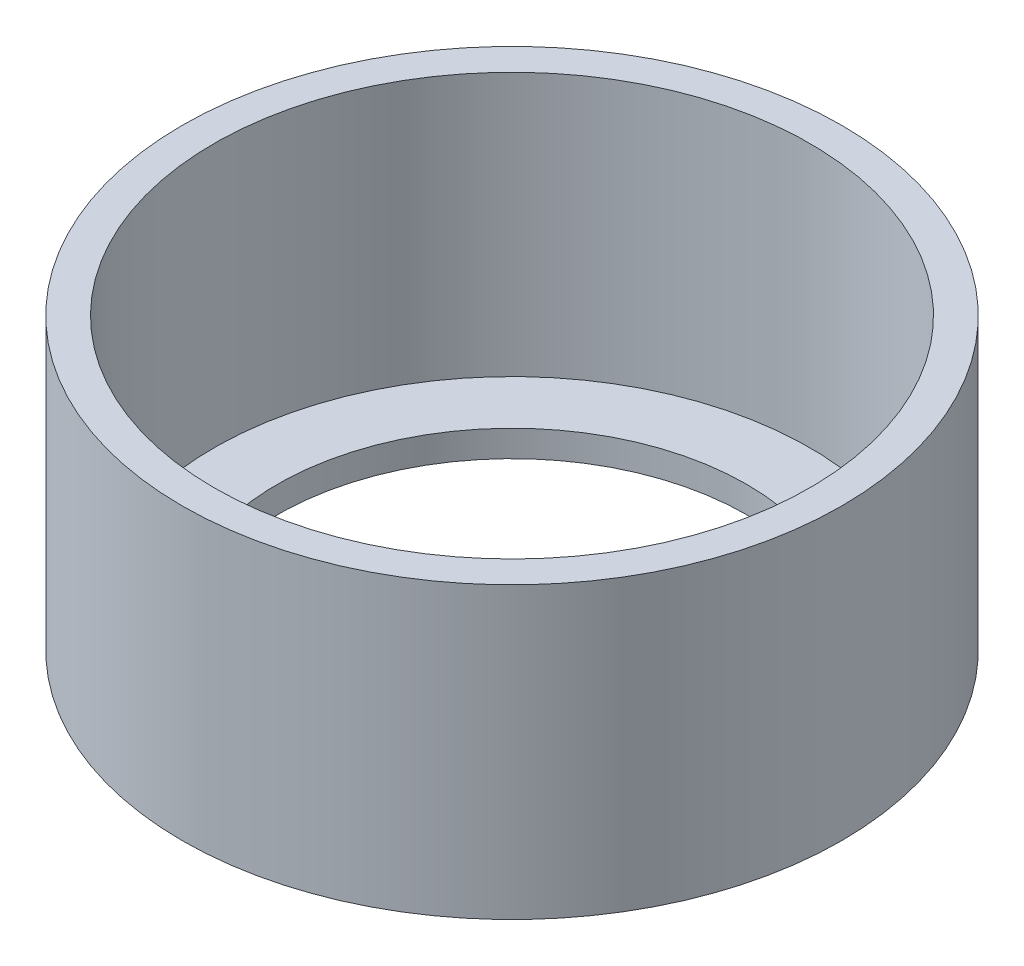
ISO-10303-21;
HEADER;
FILE_DESCRIPTION(('STEP AP214'),'2;1');
FILE_NAME('part.step','',(''),(''),'','','');
FILE_SCHEMA(('AUTOMOTIVE_DESIGN { 1 0 10303 214 1 1 1 1 }'));
ENDSEC;
DATA;
#1=APPLICATION_CONTEXT('core data for automotive mechanical design processes');
#2=APPLICATION_PROTOCOL_DEFINITION('international standard','automotive_design',2000,#1);
#3=PRODUCT_CONTEXT('',#1,'mechanical');
#4=PRODUCT('Part','Part','',(#3));
#5=PRODUCT_RELATED_PRODUCT_CATEGORY('part','',(#4));
#6=PRODUCT_DEFINITION_FORMATION('','',#4);
#7=PRODUCT_DEFINITION_CONTEXT('part definition',#1,'design');
#8=PRODUCT_DEFINITION('design','',#6,#7);
#9=PRODUCT_DEFINITION_SHAPE('','',#8);
#10=(LENGTH_UNIT() NAMED_UNIT(*) SI_UNIT(.MILLI.,.METRE.));
#11=(NAMED_UNIT(*) PLANE_ANGLE_UNIT() SI_UNIT($,.RADIAN.));
#12=(NAMED_UNIT(*) SI_UNIT($,.STERADIAN.) SOLID_ANGLE_UNIT());
#13=UNCERTAINTY_MEASURE_WITH_UNIT(LENGTH_MEASURE(1.E-05),#10,'distance_accuracy_value','');
#14=(GEOMETRIC_REPRESENTATION_CONTEXT(3) GLOBAL_UNCERTAINTY_ASSIGNED_CONTEXT((#13)) GLOBAL_UNIT_ASSIGNED_CONTEXT((#10,
#11,#12)) REPRESENTATION_CONTEXT('',''));
#15=CARTESIAN_POINT('',(0.,0.,0.));
#16=DIRECTION('',(0.,0.,1.));
#17=DIRECTION('',(1.,0.,0.));
#18=AXIS2_PLACEMENT_3D('',#15,#16,#17);
#19=CARTESIAN_POINT('',(0.,5.,0.));
#20=DIRECTION('',(0.,1.,0.));
#21=DIRECTION('',(0.,0.,1.));
#22=AXIS2_PLACEMENT_3D('',#19,#20,#21);
#23=PLANE('',#22);
#24=CARTESIAN_POINT('',(0.,5.,0.));
#25=DIRECTION('',(0.,1.,0.));
#26=DIRECTION('',(0.,0.,1.));
#27=AXIS2_PLACEMENT_3D('',#24,#25,#26);
#28=CIRCLE('',#27,6.255);
#29=CARTESIAN_POINT('',(0.,5.,6.255));
#30=VERTEX_POINT('',#29);
#31=EDGE_CURVE('E10',#30,#30,#28,.T.);
#32=ORIENTED_EDGE('',*,*,#31,.T.);
#33=EDGE_LOOP('',(#32));
#34=FACE_BOUND('',#33,.T.);
#35=CARTESIAN_POINT('',(0.,5.,0.));
#36=DIRECTION('',(0.,1.,0.));
#37=DIRECTION('',(0.,0.,1.));
#38=AXIS2_PLACEMENT_3D('',#35,#36,#37);
#39=CIRCLE('',#38,5.655);
#40=CARTESIAN_POINT('',(0.,5.,5.655));
#41=VERTEX_POINT('',#40);
#42=EDGE_CURVE('E45',#41,#41,#39,.T.);
#43=ORIENTED_EDGE('',*,*,#42,.F.);
#44=EDGE_LOOP('',(#43));
#45=FACE_BOUND('',#44,.T.);
#46=ADVANCED_FACE('F37',(#34,#45),#23,.T.);
#47=CARTESIAN_POINT('',(0.,5.,0.));
#48=DIRECTION('',(0.,-1.,0.));
#49=DIRECTION('',(0.,0.,-1.));
#50=AXIS2_PLACEMENT_3D('',#47,#48,#49);
#51=CYLINDRICAL_SURFACE('',#50,6.255);
#52=ORIENTED_EDGE('',*,*,#31,.F.);
#53=EDGE_LOOP('',(#52));
#54=FACE_BOUND('',#53,.T.);
#55=CARTESIAN_POINT('',(0.,-0.5,0.));
#56=DIRECTION('',(0.,-1.,0.));
#57=DIRECTION('',(0.,0.,-1.));
#58=AXIS2_PLACEMENT_3D('',#55,#56,#57);
#59=CIRCLE('',#58,6.255);
#60=CARTESIAN_POINT('',(0.,-0.5,-6.255));
#61=VERTEX_POINT('',#60);
#62=EDGE_CURVE('E56',#61,#61,#59,.T.);
#63=ORIENTED_EDGE('',*,*,#62,.F.);
#64=EDGE_LOOP('',(#63));
#65=FACE_BOUND('',#64,.T.);
#66=ADVANCED_FACE('F39',(#54,#65),#51,.T.);
#67=CARTESIAN_POINT('',(0.,5.,0.));
#68=DIRECTION('',(0.,-1.,0.));
#69=DIRECTION('',(0.,0.,-1.));
#70=AXIS2_PLACEMENT_3D('',#67,#68,#69);
#71=CYLINDRICAL_SURFACE('',#70,5.655);
#72=ORIENTED_EDGE('',*,*,#42,.T.);
#73=EDGE_LOOP('',(#72));
#74=FACE_BOUND('',#73,.T.);
#75=CARTESIAN_POINT('',(0.,0.,0.));
#76=DIRECTION('',(0.,1.,0.));
#77=DIRECTION('',(0.,0.,1.));
#78=AXIS2_PLACEMENT_3D('',#75,#76,#77);
#79=CIRCLE('',#78,5.655);
#80=CARTESIAN_POINT('',(0.,0.,5.655));
#81=VERTEX_POINT('',#80);
#82=EDGE_CURVE('E50',#81,#81,#79,.T.);
#83=ORIENTED_EDGE('',*,*,#82,.F.);
#84=EDGE_LOOP('',(#83));
#85=FACE_BOUND('',#84,.T.);
#86=ADVANCED_FACE('F83',(#74,#85),#71,.F.);
#87=CARTESIAN_POINT('',(0.,0.,0.));
#88=DIRECTION('',(0.,-1.,0.));
#89=DIRECTION('',(0.,0.,-1.));
#90=AXIS2_PLACEMENT_3D('',#87,#88,#89);
#91=PLANE('',#90);
#92=CARTESIAN_POINT('',(0.,0.,0.));
#93=DIRECTION('',(0.,-1.,0.));
#94=DIRECTION('',(0.,0.,-1.));
#95=AXIS2_PLACEMENT_3D('',#92,#93,#94);
#96=CIRCLE('',#95,4.455);
#97=CARTESIAN_POINT('',(0.,0.,-4.455));
#98=VERTEX_POINT('',#97);
#99=EDGE_CURVE('E62',#98,#98,#96,.T.);
#100=ORIENTED_EDGE('',*,*,#99,.T.);
#101=EDGE_LOOP('',(#100));
#102=FACE_BOUND('',#101,.T.);
#103=ORIENTED_EDGE('',*,*,#82,.T.);
#104=EDGE_LOOP('',(#103));
#105=FACE_BOUND('',#104,.T.);
#106=ADVANCED_FACE('F75',(#102,#105),#91,.F.);
#107=CARTESIAN_POINT('',(0.,-0.5,0.));
#108=DIRECTION('',(0.,-1.,0.));
#109=DIRECTION('',(0.,0.,-1.));
#110=AXIS2_PLACEMENT_3D('',#107,#108,#109);
#111=PLANE('',#110);
#112=ORIENTED_EDGE('',*,*,#62,.T.);
#113=EDGE_LOOP('',(#112));
#114=FACE_BOUND('',#113,.T.);
#115=CARTESIAN_POINT('',(0.,-0.5,0.));
#116=DIRECTION('',(0.,-1.,0.));
#117=DIRECTION('',(0.,0.,-1.));
#118=AXIS2_PLACEMENT_3D('',#115,#116,#117);
#119=CIRCLE('',#118,4.455);
#120=CARTESIAN_POINT('',(0.,-0.5,-4.455));
#121=VERTEX_POINT('',#120);
#122=EDGE_CURVE('E61',#121,#121,#119,.T.);
#123=ORIENTED_EDGE('',*,*,#122,.F.);
#124=EDGE_LOOP('',(#123));
#125=FACE_BOUND('',#124,.T.);
#126=ADVANCED_FACE('F73',(#114,#125),#111,.T.);
#127=CARTESIAN_POINT('',(0.,-0.5,0.));
#128=DIRECTION('',(0.,1.,0.));
#129=DIRECTION('',(0.,0.,1.));
#130=AXIS2_PLACEMENT_3D('',#127,#128,#129);
#131=CYLINDRICAL_SURFACE('',#130,4.455);
#132=ORIENTED_EDGE('',*,*,#122,.T.);
#133=EDGE_LOOP('',(#132));
#134=FACE_BOUND('',#133,.T.);
#135=ORIENTED_EDGE('',*,*,#99,.F.);
#136=EDGE_LOOP('',(#135));
#137=FACE_BOUND('',#136,.T.);
#138=ADVANCED_FACE('F70',(#134,#137),#131,.F.);
#139=CLOSED_SHELL('',(#46,#66,#86,#106,#126,#138));
#140=MANIFOLD_SOLID_BREP('B2',#139);
#141=ADVANCED_BREP_SHAPE_REPRESENTATION('',(#18,#140),#14);
#142=SHAPE_DEFINITION_REPRESENTATION(#9,#141);
ENDSEC;
END-ISO-10303-21;
